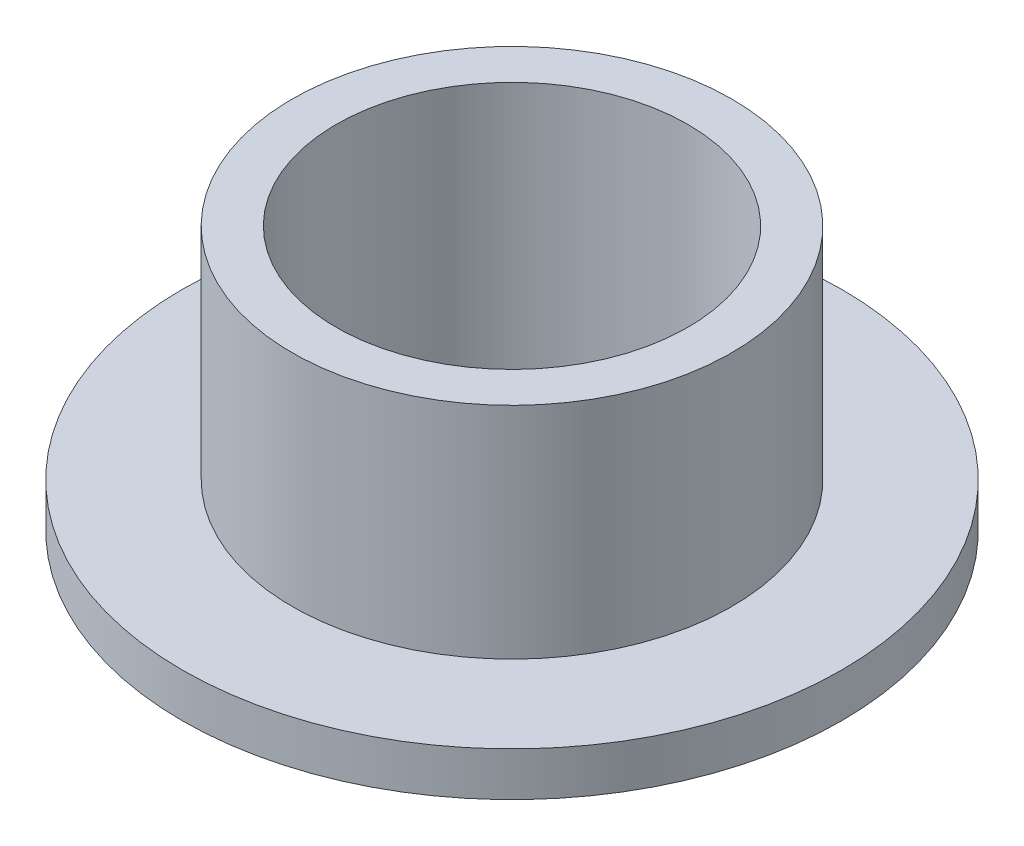
ISO-10303-21;
HEADER;
FILE_DESCRIPTION(('STEP AP214'),'2;1');
FILE_NAME('part.step','',(''),(''),'','','');
FILE_SCHEMA(('AUTOMOTIVE_DESIGN { 1 0 10303 214 1 1 1 1 }'));
ENDSEC;
DATA;
#1=APPLICATION_CONTEXT('core data for automotive mechanical design processes');
#2=APPLICATION_PROTOCOL_DEFINITION('international standard','automotive_design',2000,#1);
#3=PRODUCT_CONTEXT('',#1,'mechanical');
#4=PRODUCT('Part','Part','',(#3));
#5=PRODUCT_RELATED_PRODUCT_CATEGORY('part','',(#4));
#6=PRODUCT_DEFINITION_FORMATION('','',#4);
#7=PRODUCT_DEFINITION_CONTEXT('part definition',#1,'design');
#8=PRODUCT_DEFINITION('design','',#6,#7);
#9=PRODUCT_DEFINITION_SHAPE('','',#8);
#10=(LENGTH_UNIT() NAMED_UNIT(*) SI_UNIT(.MILLI.,.METRE.));
#11=(NAMED_UNIT(*) PLANE_ANGLE_UNIT() SI_UNIT($,.RADIAN.));
#12=(NAMED_UNIT(*) SI_UNIT($,.STERADIAN.) SOLID_ANGLE_UNIT());
#13=UNCERTAINTY_MEASURE_WITH_UNIT(LENGTH_MEASURE(1.E-05),#10,'distance_accuracy_value','');
#14=(GEOMETRIC_REPRESENTATION_CONTEXT(3) GLOBAL_UNCERTAINTY_ASSIGNED_CONTEXT((#13)) GLOBAL_UNIT_ASSIGNED_CONTEXT((#10,
#11,#12)) REPRESENTATION_CONTEXT('',''));
#15=CARTESIAN_POINT('',(0.,0.,0.));
#16=DIRECTION('',(0.,0.,1.));
#17=DIRECTION('',(1.,0.,0.));
#18=AXIS2_PLACEMENT_3D('',#15,#16,#17);
#19=CARTESIAN_POINT('',(-5.,6.,0.));
#20=DIRECTION('',(0.,-1.,0.));
#21=DIRECTION('',(0.,0.,-1.));
#22=AXIS2_PLACEMENT_3D('',#19,#20,#21);
#23=PLANE('',#22);
#24=CARTESIAN_POINT('',(0.,6.,0.));
#25=DIRECTION('',(0.,-1.,0.));
#26=DIRECTION('',(0.,0.,-1.));
#27=AXIS2_PLACEMENT_3D('',#24,#25,#26);
#28=CIRCLE('',#27,5.);
#29=CARTESIAN_POINT('',(0.,6.,-5.));
#30=VERTEX_POINT('',#29);
#31=EDGE_CURVE('E54',#30,#30,#28,.T.);
#32=ORIENTED_EDGE('',*,*,#31,.F.);
#33=EDGE_LOOP('',(#32));
#34=FACE_BOUND('',#33,.T.);
#35=CARTESIAN_POINT('',(0.,6.,0.));
#36=DIRECTION('',(0.,-1.,0.));
#37=DIRECTION('',(0.,0.,-1.));
#38=AXIS2_PLACEMENT_3D('',#35,#36,#37);
#39=CIRCLE('',#38,4.);
#40=CARTESIAN_POINT('',(0.,6.,-4.));
#41=VERTEX_POINT('',#40);
#42=EDGE_CURVE('E10',#41,#41,#39,.T.);
#43=ORIENTED_EDGE('',*,*,#42,.T.);
#44=EDGE_LOOP('',(#43));
#45=FACE_BOUND('',#44,.T.);
#46=ADVANCED_FACE('F32',(#34,#45),#23,.F.);
#47=CARTESIAN_POINT('',(0.,0.,0.));
#48=DIRECTION('',(0.,-1.,0.));
#49=DIRECTION('',(0.,0.,-1.));
#50=AXIS2_PLACEMENT_3D('',#47,#48,#49);
#51=CYLINDRICAL_SURFACE('',#50,4.);
#52=ORIENTED_EDGE('',*,*,#42,.F.);
#53=EDGE_LOOP('',(#52));
#54=FACE_BOUND('',#53,.T.);
#55=CARTESIAN_POINT('',(0.,0.,0.));
#56=DIRECTION('',(0.,-1.,0.));
#57=DIRECTION('',(0.,0.,-1.));
#58=AXIS2_PLACEMENT_3D('',#55,#56,#57);
#59=CIRCLE('',#58,3.99999999999999);
#60=CARTESIAN_POINT('',(0.,0.,-3.99999999999999));
#61=VERTEX_POINT('',#60);
#62=EDGE_CURVE('E38',#61,#61,#59,.T.);
#63=ORIENTED_EDGE('',*,*,#62,.T.);
#64=EDGE_LOOP('',(#63));
#65=FACE_BOUND('',#64,.T.);
#66=ADVANCED_FACE('F61',(#54,#65),#51,.F.);
#67=CARTESIAN_POINT('',(-3.99999999999999,0.,0.));
#68=DIRECTION('',(0.,1.,0.));
#69=DIRECTION('',(0.,0.,1.));
#70=AXIS2_PLACEMENT_3D('',#67,#68,#69);
#71=PLANE('',#70);
#72=ORIENTED_EDGE('',*,*,#62,.F.);
#73=EDGE_LOOP('',(#72));
#74=FACE_BOUND('',#73,.T.);
#75=CARTESIAN_POINT('',(0.,0.,0.));
#76=DIRECTION('',(0.,-1.,0.));
#77=DIRECTION('',(0.,0.,-1.));
#78=AXIS2_PLACEMENT_3D('',#75,#76,#77);
#79=CIRCLE('',#78,7.5);
#80=CARTESIAN_POINT('',(0.,0.,-7.5));
#81=VERTEX_POINT('',#80);
#82=EDGE_CURVE('E42',#81,#81,#79,.T.);
#83=ORIENTED_EDGE('',*,*,#82,.T.);
#84=EDGE_LOOP('',(#83));
#85=FACE_BOUND('',#84,.T.);
#86=ADVANCED_FACE('F65',(#74,#85),#71,.F.);
#87=CARTESIAN_POINT('',(0.,0.,0.));
#88=DIRECTION('',(0.,-1.,0.));
#89=DIRECTION('',(0.,0.,-1.));
#90=AXIS2_PLACEMENT_3D('',#87,#88,#89);
#91=CYLINDRICAL_SURFACE('',#90,7.5);
#92=ORIENTED_EDGE('',*,*,#82,.F.);
#93=EDGE_LOOP('',(#92));
#94=FACE_BOUND('',#93,.T.);
#95=CARTESIAN_POINT('',(0.,1.,0.));
#96=DIRECTION('',(0.,-1.,0.));
#97=DIRECTION('',(0.,0.,-1.));
#98=AXIS2_PLACEMENT_3D('',#95,#96,#97);
#99=CIRCLE('',#98,7.5);
#100=CARTESIAN_POINT('',(0.,1.,-7.5));
#101=VERTEX_POINT('',#100);
#102=EDGE_CURVE('E46',#101,#101,#99,.T.);
#103=ORIENTED_EDGE('',*,*,#102,.T.);
#104=EDGE_LOOP('',(#103));
#105=FACE_BOUND('',#104,.T.);
#106=ADVANCED_FACE('F70',(#94,#105),#91,.T.);
#107=CARTESIAN_POINT('',(-7.5,0.999999999999999,0.));
#108=DIRECTION('',(0.,-1.,0.));
#109=DIRECTION('',(0.,0.,-1.));
#110=AXIS2_PLACEMENT_3D('',#107,#108,#109);
#111=PLANE('',#110);
#112=ORIENTED_EDGE('',*,*,#102,.F.);
#113=EDGE_LOOP('',(#112));
#114=FACE_BOUND('',#113,.T.);
#115=CARTESIAN_POINT('',(0.,0.999999999999999,0.));
#116=DIRECTION('',(0.,-1.,0.));
#117=DIRECTION('',(0.,0.,-1.));
#118=AXIS2_PLACEMENT_3D('',#115,#116,#117);
#119=CIRCLE('',#118,5.);
#120=CARTESIAN_POINT('',(0.,0.999999999999999,-5.));
#121=VERTEX_POINT('',#120);
#122=EDGE_CURVE('E51',#121,#121,#119,.T.);
#123=ORIENTED_EDGE('',*,*,#122,.T.);
#124=EDGE_LOOP('',(#123));
#125=FACE_BOUND('',#124,.T.);
#126=ADVANCED_FACE('F76',(#114,#125),#111,.F.);
#127=CARTESIAN_POINT('',(0.,0.,0.));
#128=DIRECTION('',(0.,-1.,0.));
#129=DIRECTION('',(0.,0.,-1.));
#130=AXIS2_PLACEMENT_3D('',#127,#128,#129);
#131=CYLINDRICAL_SURFACE('',#130,5.);
#132=ORIENTED_EDGE('',*,*,#122,.F.);
#133=EDGE_LOOP('',(#132));
#134=FACE_BOUND('',#133,.T.);
#135=ORIENTED_EDGE('',*,*,#31,.T.);
#136=EDGE_LOOP('',(#135));
#137=FACE_BOUND('',#136,.T.);
#138=ADVANCED_FACE('F58',(#134,#137),#131,.T.);
#139=CLOSED_SHELL('',(#46,#66,#86,#106,#126,#138));
#140=MANIFOLD_SOLID_BREP('B2',#139);
#141=ADVANCED_BREP_SHAPE_REPRESENTATION('',(#18,#140),#14);
#142=SHAPE_DEFINITION_REPRESENTATION(#9,#141);
ENDSEC;
END-ISO-10303-21;
